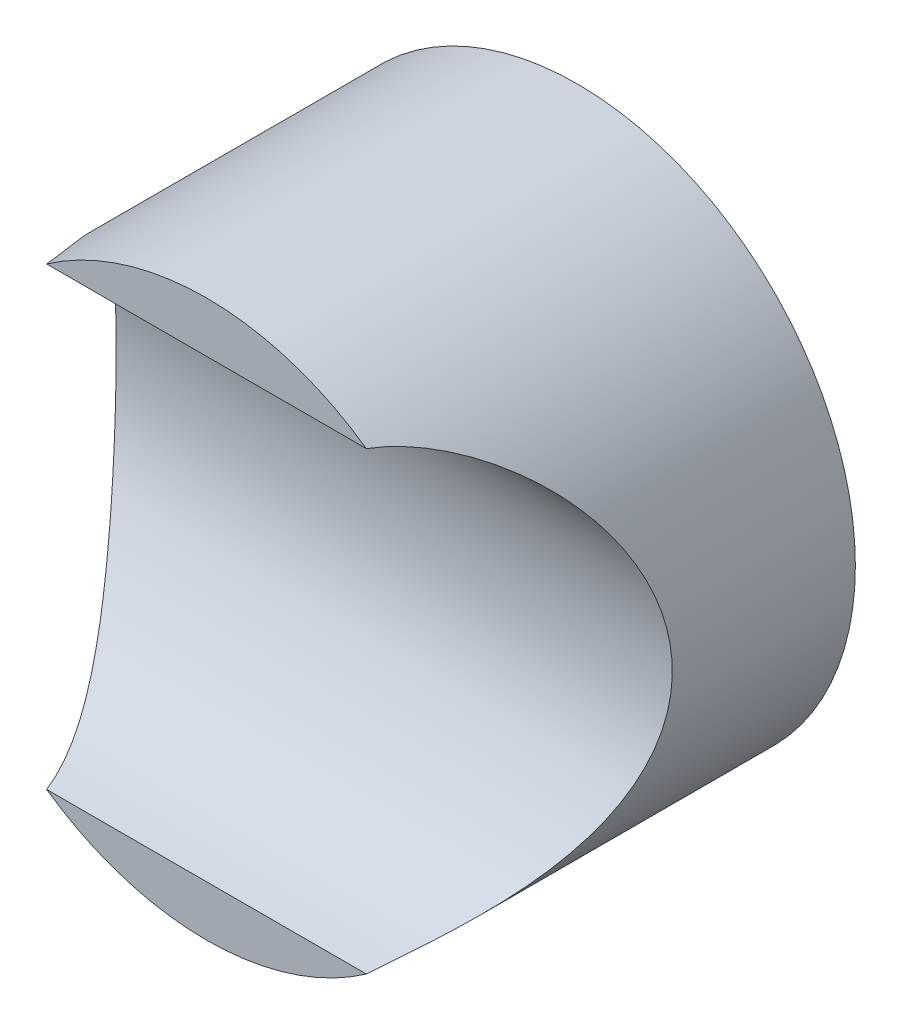
ISO-10303-21;
HEADER;
FILE_DESCRIPTION(('STEP AP214'),'2;1');
FILE_NAME('part.step','',(''),(''),'','','');
FILE_SCHEMA(('AUTOMOTIVE_DESIGN { 1 0 10303 214 1 1 1 1 }'));
ENDSEC;
DATA;
#1=APPLICATION_CONTEXT('core data for automotive mechanical design processes');
#2=APPLICATION_PROTOCOL_DEFINITION('international standard','automotive_design',2000,#1);
#3=PRODUCT_CONTEXT('',#1,'mechanical');
#4=PRODUCT('Part','Part','',(#3));
#5=PRODUCT_RELATED_PRODUCT_CATEGORY('part','',(#4));
#6=PRODUCT_DEFINITION_FORMATION('','',#4);
#7=PRODUCT_DEFINITION_CONTEXT('part definition',#1,'design');
#8=PRODUCT_DEFINITION('design','',#6,#7);
#9=PRODUCT_DEFINITION_SHAPE('','',#8);
#10=(LENGTH_UNIT() NAMED_UNIT(*) SI_UNIT(.MILLI.,.METRE.));
#11=(NAMED_UNIT(*) PLANE_ANGLE_UNIT() SI_UNIT($,.RADIAN.));
#12=(NAMED_UNIT(*) SI_UNIT($,.STERADIAN.) SOLID_ANGLE_UNIT());
#13=UNCERTAINTY_MEASURE_WITH_UNIT(LENGTH_MEASURE(1.E-05),#10,'distance_accuracy_value','');
#14=(GEOMETRIC_REPRESENTATION_CONTEXT(3) GLOBAL_UNCERTAINTY_ASSIGNED_CONTEXT((#13)) GLOBAL_UNIT_ASSIGNED_CONTEXT((#10,
#11,#12)) REPRESENTATION_CONTEXT('',''));
#15=CARTESIAN_POINT('',(0.,0.,0.));
#16=DIRECTION('',(0.,0.,1.));
#17=DIRECTION('',(1.,0.,0.));
#18=AXIS2_PLACEMENT_3D('',#15,#16,#17);
#19=CARTESIAN_POINT('',(0.,0.,40.));
#20=DIRECTION('',(0.,0.,1.));
#21=DIRECTION('',(1.,0.,0.));
#22=AXIS2_PLACEMENT_3D('',#19,#20,#21);
#23=PLANE('',#22);
#24=DIRECTION('',(1.,0.,0.));
#25=VECTOR('',#24,1.);
#26=CARTESIAN_POINT('',(-30.,-24.5452103521427,40.));
#27=LINE('',#26,#25);
#28=CARTESIAN_POINT('',(-17.249134725228,-24.5452103521427,40.));
#29=VERTEX_POINT('',#28);
#30=CARTESIAN_POINT('',(17.249134725228,-24.5452103521427,40.));
#31=VERTEX_POINT('',#30);
#32=EDGE_CURVE('E11',#29,#31,#27,.T.);
#33=ORIENTED_EDGE('',*,*,#32,.F.);
#34=CARTESIAN_POINT('',(0.,0.,40.));
#35=DIRECTION('',(0.,0.,1.));
#36=DIRECTION('',(1.,0.,0.));
#37=AXIS2_PLACEMENT_3D('',#34,#35,#36);
#38=CIRCLE('',#37,30.);
#39=EDGE_CURVE('E71',#29,#31,#38,.T.);
#40=ORIENTED_EDGE('',*,*,#39,.T.);
#41=EDGE_LOOP('',(#33,#40));
#42=FACE_BOUND('',#41,.T.);
#43=ADVANCED_FACE('F39',(#42),#23,.T.);
#44=CARTESIAN_POINT('',(0.,0.,40.));
#45=DIRECTION('',(0.,0.,-1.));
#46=DIRECTION('',(-1.,0.,0.));
#47=AXIS2_PLACEMENT_3D('',#44,#45,#46);
#48=CYLINDRICAL_SURFACE('',#47,30.);
#49=CARTESIAN_POINT('',(17.249134725228,24.5452103521427,40.));
#50=VERTEX_POINT('',#49);
#51=CARTESIAN_POINT('',(-17.249134725228,24.5452103521427,40.));
#52=VERTEX_POINT('',#51);
#53=EDGE_CURVE('E69',#50,#52,#38,.T.);
#54=ORIENTED_EDGE('',*,*,#53,.F.);
#55=CARTESIAN_POINT('',(17.249134725228,24.5452103521427,40.));
#56=CARTESIAN_POINT('',(17.3456637872006,24.4773760764151,39.6492450799394));
#57=CARTESIAN_POINT('',(17.4509957520615,24.4025037661638,39.3024160576223));
#58=CARTESIAN_POINT('',(17.6767778042311,24.2394485499741,38.6171678382151));
#59=CARTESIAN_POINT('',(17.7972171494787,24.1512750928412,38.2787428682746));
#60=CARTESIAN_POINT('',(18.0504615603682,23.962589140414,37.6114390691279));
#61=CARTESIAN_POINT('',(18.1832255953066,23.8621172559971,37.282533030278));
#62=CARTESIAN_POINT('',(18.4593215668455,23.6491838996391,36.6331104979196));
#63=CARTESIAN_POINT('',(18.602655568781,23.5367200825911,36.3125956606898));
#64=CARTESIAN_POINT('',(19.0446726055925,23.1828003707353,35.3654137513566));
#65=CARTESIAN_POINT('',(19.3561834534077,22.924222735384,34.751034852978));
#66=CARTESIAN_POINT('',(20.0008816953985,22.36398128985,33.5535640156192));
#67=CARTESIAN_POINT('',(20.3340915986709,22.0622723377455,32.9705057481412));
#68=CARTESIAN_POINT('',(21.0832241496513,21.3498857180443,31.715884553071));
#69=CARTESIAN_POINT('',(21.5018525820912,20.9296205328434,31.0513646379643));
#70=CARTESIAN_POINT('',(22.3424306255643,20.0298573695418,29.7662059405244));
#71=CARTESIAN_POINT('',(22.764379926997,19.550364853293,29.1455631202015));
#72=CARTESIAN_POINT('',(23.6011025761193,18.5316785969205,27.9481816956885));
#73=CARTESIAN_POINT('',(24.0158654897443,17.9924052919151,27.3715033700989));
#74=CARTESIAN_POINT('',(24.8275090486665,16.8547576314341,26.2658963211141));
#75=CARTESIAN_POINT('',(25.2243945193162,16.2563993646376,25.7369546738198));
#76=CARTESIAN_POINT('',(25.901410060431,15.1471248279558,24.8484848723616));
#77=CARTESIAN_POINT('',(26.1872136846149,14.6482737394089,24.4781809396392));
#78=CARTESIAN_POINT('',(26.7382158208434,13.6165261302304,23.7711257585506));
#79=CARTESIAN_POINT('',(27.0034159549897,13.0836322957975,23.4343718682171));
#80=CARTESIAN_POINT('',(27.5083702374627,11.985575259723,22.7981021867074));
#81=CARTESIAN_POINT('',(27.7481609719762,11.4204603077512,22.4985327452194));
#82=CARTESIAN_POINT('',(28.0855629873626,10.5497919734755,22.0795748215035));
#83=CARTESIAN_POINT('',(28.1943128454604,10.2557473936417,21.9449924592543));
#84=CARTESIAN_POINT('',(28.4038830515337,9.66018143760121,21.6863641087691));
#85=CARTESIAN_POINT('',(28.5047012981422,9.3586581076501,21.5623209120428));
#86=CARTESIAN_POINT('',(28.7636076127421,8.54073238163488,21.2445483477689));
#87=CARTESIAN_POINT('',(28.913925924475,8.01786863366453,21.0609076136637));
#88=CARTESIAN_POINT('',(29.1878721587688,6.95480846512938,20.7272617090758));
#89=CARTESIAN_POINT('',(29.3115049853904,6.41461525024023,20.5772503582385));
#90=CARTESIAN_POINT('',(29.5296345729785,5.32081387249773,20.3131740619917));
#91=CARTESIAN_POINT('',(29.6241854363776,4.76723271168898,20.1990423592787));
#92=CARTESIAN_POINT('',(29.7825321701044,3.64953052783866,20.0081810885403));
#93=CARTESIAN_POINT('',(29.8463429484611,3.0854147519393,19.9314333901809));
#94=CARTESIAN_POINT('',(29.9292863586105,2.10078985691042,19.8317467092083));
#95=CARTESIAN_POINT('',(29.9557723903584,1.6817659764275,19.7999443092807));
#96=CARTESIAN_POINT('',(29.9911323426357,0.841845115930386,19.7574958813311));
#97=CARTESIAN_POINT('',(30.0000036042539,0.420947862743485,19.7468530472993));
#98=CARTESIAN_POINT('',(29.9999949207133,-0.593219832914178,19.7468619081437));
#99=CARTESIAN_POINT('',(29.9823645419507,-1.18654017535763,19.7680108428263));
#100=CARTESIAN_POINT('',(29.912231115269,-2.36837351381449,19.8522368272949));
#101=CARTESIAN_POINT('',(29.8597090696207,-2.95688371400605,19.9153367184493));
#102=CARTESIAN_POINT('',(29.7208566059373,-4.12522014991265,20.0824798693034));
#103=CARTESIAN_POINT('',(29.634458301101,-4.70502650579282,20.1866053448452));
#104=CARTESIAN_POINT('',(29.4297755848008,-5.85036431882013,20.43396901525));
#105=CARTESIAN_POINT('',(29.3114948331949,-6.41589740628394,20.5772027208156));
#106=CARTESIAN_POINT('',(29.0463436120151,-7.5255051527662,20.8994584624447));
#107=CARTESIAN_POINT('',(28.8996656036885,-8.06969615952752,21.0782397848295));
#108=CARTESIAN_POINT('',(28.5799442230966,-9.13769917393854,21.4697012696507));
#109=CARTESIAN_POINT('',(28.4069006648122,-9.66151103777272,21.6823816712588));
#110=CARTESIAN_POINT('',(28.0374278619561,-10.6864072170946,22.1389963591995));
#111=CARTESIAN_POINT('',(27.8410087309075,-11.1875012328846,22.3829171327315));
#112=CARTESIAN_POINT('',(27.4276215747644,-12.165839088112,22.8996948172501));
#113=CARTESIAN_POINT('',(27.2106491924945,-12.6430778374593,23.1725578653132));
#114=CARTESIAN_POINT('',(26.8305707430692,-13.4255469457609,23.6543469640817));
#115=CARTESIAN_POINT('',(26.6721281033317,-13.7374469260185,23.8562050853413));
#116=CARTESIAN_POINT('',(26.3480007929741,-14.3493103061191,24.2716520557926));
#117=CARTESIAN_POINT('',(26.1823176575329,-14.6492762107852,24.485238420723));
#118=CARTESIAN_POINT('',(25.6755915483709,-15.5313816739917,25.1429197015013));
#119=CARTESIAN_POINT('',(25.3249326340286,-16.0956052252847,25.6038602048081));
#120=CARTESIAN_POINT('',(24.6041933135222,-17.17724238879,26.5680416640283));
#121=CARTESIAN_POINT('',(24.2340499096166,-17.6944872919278,27.0714234551633));
#122=CARTESIAN_POINT('',(23.4828202474875,-18.6799584423827,28.1163182476561));
#123=CARTESIAN_POINT('',(23.101735503847,-19.1481914330072,28.6578259862597));
#124=CARTESIAN_POINT('',(22.3288783149011,-20.0444029921208,29.7884923031105));
#125=CARTESIAN_POINT('',(21.9370431140201,-20.4714082323988,30.3783788209371));
#126=CARTESIAN_POINT('',(21.1593655047435,-21.274245003028,31.5962424197635));
#127=CARTESIAN_POINT('',(20.7735254872196,-21.6500565590613,32.2242342310169));
#128=CARTESIAN_POINT('',(20.0218074346577,-22.3469981330934,33.5153386672197));
#129=CARTESIAN_POINT('',(19.6558267766784,-22.6684320869978,34.178226949983));
#130=CARTESIAN_POINT('',(18.9564800376353,-23.2563952248731,35.5440364316996));
#131=CARTESIAN_POINT('',(18.6230790572445,-23.5229835056194,36.2469134883948));
#132=CARTESIAN_POINT('',(18.2128279870635,-23.8392541780106,37.2132546733433));
#133=CARTESIAN_POINT('',(18.112686465334,-23.9153778293991,37.4584256510882));
#134=CARTESIAN_POINT('',(17.9192256746238,-24.0606714825537,37.9534309468576));
#135=CARTESIAN_POINT('',(17.8259047993798,-24.129843122968,38.2032641494166));
#136=CARTESIAN_POINT('',(17.5571161981603,-24.3268842561337,38.9610510220702));
#137=CARTESIAN_POINT('',(17.3933739993382,-24.4438596625826,39.4760161857731));
#138=CARTESIAN_POINT('',(17.249134725228,-24.5452103521427,40.));
#139=B_SPLINE_CURVE_WITH_KNOTS('',3,(#55,#56,#57,#58,#59,#60,#61,#62,#63,#64,#65,#66,#67,#68,
#69,#70,#71,#72,#73,#74,#75,#76,#77,#78,#79,#80,#81,#82,#83,#84,#85,#86,#87,#88,#89,#90,#91,#92,
#93,#94,#95,#96,#97,#98,#99,#100,#101,#102,#103,#104,#105,#106,#107,#108,#109,#110,#111,#112,
#113,#114,#115,#116,#117,#118,#119,#120,#121,#122,#123,#124,#125,#126,#127,#128,#129,#130,#131,
#132,#133,#134,#135,#136,#137,#138),.UNSPECIFIED.,.F.,.F.,(4,2,2,2,2,2,2,2,2,2,2,2,2,2,2,2,2,2,
2,2,2,2,2,2,2,2,2,2,2,2,2,2,2,2,2,2,2,2,2,2,2,4),(0.,1.10980754438397,2.21883038951801,
3.32428519222282,4.42995657225575,6.63440905384714,8.84118587567714,11.510199789753,
14.1789677550396,16.8513313425389,19.5229692486675,21.5727456086561,23.6223604269728,
25.6689827787284,26.6922212897759,27.7157299866405,29.4364390150376,31.1568315545449,
32.8740039407493,34.5903427088431,35.8526708657696,37.1151895539046,38.8943911879151,
40.674562352114,42.458319299194,44.2418715719338,46.0137342362044,47.7856094022339,
49.556720728381,51.3282083641878,52.5394978813873,53.7505318071829,56.1730711437745,
58.6039920855952,61.0345781281581,63.5129887193242,65.9923635628149,68.4573863460181,
70.9197389676975,71.7462541992134,72.5725741548752,74.2295548489852),.UNSPECIFIED.);
#140=EDGE_CURVE('E55',#50,#31,#139,.T.);
#141=ORIENTED_EDGE('',*,*,#140,.T.);
#142=ORIENTED_EDGE('',*,*,#39,.F.);
#143=CARTESIAN_POINT('',(-17.249134725228,-24.5452103521427,40.));
#144=CARTESIAN_POINT('',(-17.3456637872006,-24.4773760764151,39.6492450799394));
#145=CARTESIAN_POINT('',(-17.4509957520615,-24.4025037661638,39.3024160576223));
#146=CARTESIAN_POINT('',(-17.6767778042311,-24.2394485499741,38.6171678382151));
#147=CARTESIAN_POINT('',(-17.7972171494787,-24.1512750928412,38.2787428682746));
#148=CARTESIAN_POINT('',(-18.0504615603682,-23.962589140414,37.6114390691279));
#149=CARTESIAN_POINT('',(-18.1832255953066,-23.8621172559971,37.282533030278));
#150=CARTESIAN_POINT('',(-18.4593215668455,-23.6491838996391,36.6331104979196));
#151=CARTESIAN_POINT('',(-18.602655568781,-23.5367200825911,36.3125956606898));
#152=CARTESIAN_POINT('',(-19.0446726055925,-23.1828003707353,35.3654137513566));
#153=CARTESIAN_POINT('',(-19.3561834534077,-22.924222735384,34.751034852978));
#154=CARTESIAN_POINT('',(-20.0008816953985,-22.36398128985,33.5535640156192));
#155=CARTESIAN_POINT('',(-20.3340915986709,-22.0622723377455,32.9705057481412));
#156=CARTESIAN_POINT('',(-21.0832241496513,-21.3498857180443,31.715884553071));
#157=CARTESIAN_POINT('',(-21.5018525820912,-20.9296205328434,31.0513646379643));
#158=CARTESIAN_POINT('',(-22.3424306255643,-20.0298573695418,29.7662059405244));
#159=CARTESIAN_POINT('',(-22.764379926997,-19.550364853293,29.1455631202015));
#160=CARTESIAN_POINT('',(-23.6011025761193,-18.5316785969205,27.9481816956885));
#161=CARTESIAN_POINT('',(-24.0158654897443,-17.9924052919151,27.3715033700989));
#162=CARTESIAN_POINT('',(-24.8275090486665,-16.8547576314341,26.2658963211141));
#163=CARTESIAN_POINT('',(-25.2243945193162,-16.2563993646376,25.7369546738198));
#164=CARTESIAN_POINT('',(-25.901410060431,-15.1471248279558,24.8484848723616));
#165=CARTESIAN_POINT('',(-26.1872136846149,-14.6482737394089,24.4781809396392));
#166=CARTESIAN_POINT('',(-26.7382158208434,-13.6165261302304,23.7711257585506));
#167=CARTESIAN_POINT('',(-27.0034159549897,-13.0836322957975,23.4343718682171));
#168=CARTESIAN_POINT('',(-27.5083702374627,-11.985575259723,22.7981021867074));
#169=CARTESIAN_POINT('',(-27.7481609719762,-11.4204603077512,22.4985327452194));
#170=CARTESIAN_POINT('',(-28.0855629873626,-10.5497919734755,22.0795748215035));
#171=CARTESIAN_POINT('',(-28.1943128454604,-10.2557473936417,21.9449924592543));
#172=CARTESIAN_POINT('',(-28.4038830515337,-9.66018143760121,21.6863641087691));
#173=CARTESIAN_POINT('',(-28.5047012981422,-9.3586581076501,21.5623209120428));
#174=CARTESIAN_POINT('',(-28.7636076127421,-8.54073238163488,21.2445483477689));
#175=CARTESIAN_POINT('',(-28.913925924475,-8.01786863366453,21.0609076136637));
#176=CARTESIAN_POINT('',(-29.1878721587688,-6.95480846512938,20.7272617090758));
#177=CARTESIAN_POINT('',(-29.3115049853904,-6.41461525024023,20.5772503582385));
#178=CARTESIAN_POINT('',(-29.5296345729785,-5.32081387249773,20.3131740619917));
#179=CARTESIAN_POINT('',(-29.6241854363776,-4.76723271168898,20.1990423592787));
#180=CARTESIAN_POINT('',(-29.7825321701044,-3.64953052783866,20.0081810885403));
#181=CARTESIAN_POINT('',(-29.8463429484611,-3.0854147519393,19.9314333901809));
#182=CARTESIAN_POINT('',(-29.9292863586105,-2.10078985691042,19.8317467092083));
#183=CARTESIAN_POINT('',(-29.9557723903584,-1.6817659764275,19.7999443092807));
#184=CARTESIAN_POINT('',(-29.9911323426357,-0.841845115930386,19.7574958813311));
#185=CARTESIAN_POINT('',(-30.0000036042539,-0.420947862743485,19.7468530472993));
#186=CARTESIAN_POINT('',(-29.9999949207133,0.593219832914178,19.7468619081437));
#187=CARTESIAN_POINT('',(-29.9823645419507,1.18654017535763,19.7680108428263));
#188=CARTESIAN_POINT('',(-29.912231115269,2.36837351381449,19.8522368272949));
#189=CARTESIAN_POINT('',(-29.8597090696207,2.95688371400605,19.9153367184493));
#190=CARTESIAN_POINT('',(-29.7208566059373,4.12522014991265,20.0824798693034));
#191=CARTESIAN_POINT('',(-29.634458301101,4.70502650579282,20.1866053448452));
#192=CARTESIAN_POINT('',(-29.4297755848008,5.85036431882013,20.43396901525));
#193=CARTESIAN_POINT('',(-29.3114948331949,6.41589740628394,20.5772027208156));
#194=CARTESIAN_POINT('',(-29.0463436120151,7.5255051527662,20.8994584624447));
#195=CARTESIAN_POINT('',(-28.8996656036885,8.06969615952752,21.0782397848295));
#196=CARTESIAN_POINT('',(-28.5799442230966,9.13769917393854,21.4697012696507));
#197=CARTESIAN_POINT('',(-28.4069006648122,9.66151103777272,21.6823816712588));
#198=CARTESIAN_POINT('',(-28.0374278619561,10.6864072170946,22.1389963591995));
#199=CARTESIAN_POINT('',(-27.8410087309075,11.1875012328846,22.3829171327315));
#200=CARTESIAN_POINT('',(-27.4276215747644,12.165839088112,22.8996948172501));
#201=CARTESIAN_POINT('',(-27.2106491924945,12.6430778374593,23.1725578653132));
#202=CARTESIAN_POINT('',(-26.8305707430692,13.4255469457609,23.6543469640817));
#203=CARTESIAN_POINT('',(-26.6721281033317,13.7374469260185,23.8562050853413));
#204=CARTESIAN_POINT('',(-26.3480007929741,14.3493103061191,24.2716520557926));
#205=CARTESIAN_POINT('',(-26.1823176575329,14.6492762107852,24.485238420723));
#206=CARTESIAN_POINT('',(-25.6755915483709,15.5313816739917,25.1429197015013));
#207=CARTESIAN_POINT('',(-25.3249326340286,16.0956052252847,25.6038602048081));
#208=CARTESIAN_POINT('',(-24.6041933135222,17.17724238879,26.5680416640283));
#209=CARTESIAN_POINT('',(-24.2340499096166,17.6944872919278,27.0714234551633));
#210=CARTESIAN_POINT('',(-23.4828202474875,18.6799584423827,28.1163182476561));
#211=CARTESIAN_POINT('',(-23.101735503847,19.1481914330072,28.6578259862597));
#212=CARTESIAN_POINT('',(-22.3288783149011,20.0444029921208,29.7884923031105));
#213=CARTESIAN_POINT('',(-21.9370431140201,20.4714082323988,30.3783788209371));
#214=CARTESIAN_POINT('',(-21.1593655047435,21.274245003028,31.5962424197635));
#215=CARTESIAN_POINT('',(-20.7735254872196,21.6500565590613,32.2242342310169));
#216=CARTESIAN_POINT('',(-20.0218074346577,22.3469981330934,33.5153386672197));
#217=CARTESIAN_POINT('',(-19.6558267766784,22.6684320869978,34.178226949983));
#218=CARTESIAN_POINT('',(-18.9564800376353,23.2563952248731,35.5440364316996));
#219=CARTESIAN_POINT('',(-18.6230790572445,23.5229835056194,36.2469134883948));
#220=CARTESIAN_POINT('',(-18.2128279870635,23.8392541780106,37.2132546733433));
#221=CARTESIAN_POINT('',(-18.112686465334,23.9153778293991,37.4584256510882));
#222=CARTESIAN_POINT('',(-17.9192256746238,24.0606714825537,37.9534309468576));
#223=CARTESIAN_POINT('',(-17.8259047993798,24.129843122968,38.2032641494166));
#224=CARTESIAN_POINT('',(-17.5571161981603,24.3268842561337,38.9610510220702));
#225=CARTESIAN_POINT('',(-17.3933739993382,24.4438596625826,39.4760161857731));
#226=CARTESIAN_POINT('',(-17.249134725228,24.5452103521427,40.));
#227=B_SPLINE_CURVE_WITH_KNOTS('',3,(#143,#144,#145,#146,#147,#148,#149,#150,#151,#152,#153,
#154,#155,#156,#157,#158,#159,#160,#161,#162,#163,#164,#165,#166,#167,#168,#169,#170,#171,#172,
#173,#174,#175,#176,#177,#178,#179,#180,#181,#182,#183,#184,#185,#186,#187,#188,#189,#190,#191,
#192,#193,#194,#195,#196,#197,#198,#199,#200,#201,#202,#203,#204,#205,#206,#207,#208,#209,#210,
#211,#212,#213,#214,#215,#216,#217,#218,#219,#220,#221,#222,#223,#224,#225,#226),.UNSPECIFIED.,
.F.,.F.,(4,2,2,2,2,2,2,2,2,2,2,2,2,2,2,2,2,2,2,2,2,2,2,2,2,2,2,2,2,2,2,2,2,2,2,2,2,2,2,2,2,4),
(0.,1.10980754438397,2.21883038951801,3.32428519222282,4.42995657225575,6.63440905384714,
8.84118587567714,11.510199789753,14.1789677550396,16.8513313425389,19.5229692486675,
21.5727456086561,23.6223604269728,25.6689827787284,26.6922212897759,27.7157299866405,
29.4364390150376,31.1568315545449,32.8740039407493,34.5903427088431,35.8526708657696,
37.1151895539046,38.8943911879151,40.674562352114,42.458319299194,44.2418715719338,
46.0137342362044,47.7856094022339,49.556720728381,51.3282083641878,52.5394978813873,
53.7505318071829,56.1730711437745,58.6039920855952,61.0345781281581,63.5129887193242,
65.9923635628149,68.4573863460181,70.9197389676975,71.7462541992134,72.5725741548752,
74.2295548489852),.UNSPECIFIED.);
#228=EDGE_CURVE('E66',#29,#52,#227,.T.);
#229=ORIENTED_EDGE('',*,*,#228,.T.);
#230=EDGE_LOOP('',(#54,#141,#142,#229));
#231=FACE_BOUND('',#230,.T.);
#232=CARTESIAN_POINT('',(0.,0.,0.));
#233=DIRECTION('',(0.,0.,1.));
#234=DIRECTION('',(1.,0.,0.));
#235=AXIS2_PLACEMENT_3D('',#232,#233,#234);
#236=CIRCLE('',#235,30.);
#237=CARTESIAN_POINT('',(30.,0.,0.));
#238=VERTEX_POINT('',#237);
#239=EDGE_CURVE('E83',#238,#238,#236,.T.);
#240=ORIENTED_EDGE('',*,*,#239,.T.);
#241=EDGE_LOOP('',(#240));
#242=FACE_BOUND('',#241,.T.);
#243=ADVANCED_FACE('F41',(#231,#242),#48,.T.);
#244=DIRECTION('',(1.,0.,0.));
#245=VECTOR('',#244,1.);
#246=CARTESIAN_POINT('',(-30.,24.5452103521427,40.));
#247=LINE('',#246,#245);
#248=EDGE_CURVE('E49',#50,#52,#247,.F.);
#249=ORIENTED_EDGE('',*,*,#248,.F.);
#250=ORIENTED_EDGE('',*,*,#53,.T.);
#251=EDGE_LOOP('',(#249,#250));
#252=FACE_BOUND('',#251,.T.);
#253=ADVANCED_FACE('F79',(#252),#23,.T.);
#254=CARTESIAN_POINT('',(0.,0.,0.));
#255=DIRECTION('',(0.,0.,1.));
#256=DIRECTION('',(1.,0.,0.));
#257=AXIS2_PLACEMENT_3D('',#254,#255,#256);
#258=PLANE('',#257);
#259=CARTESIAN_POINT('',(0.,0.,0.));
#260=DIRECTION('',(0.,0.,-1.));
#261=DIRECTION('',(-1.,0.,0.));
#262=AXIS2_PLACEMENT_3D('',#259,#260,#261);
#263=CIRCLE('',#262,10.);
#264=CARTESIAN_POINT('',(-10.,0.,0.));
#265=VERTEX_POINT('',#264);
#266=EDGE_CURVE('E98',#265,#265,#263,.T.);
#267=ORIENTED_EDGE('',*,*,#266,.F.);
#268=EDGE_LOOP('',(#267));
#269=FACE_BOUND('',#268,.T.);
#270=ORIENTED_EDGE('',*,*,#239,.F.);
#271=EDGE_LOOP('',(#270));
#272=FACE_BOUND('',#271,.T.);
#273=ADVANCED_FACE('F113',(#269,#272),#258,.F.);
#274=CARTESIAN_POINT('',(-30.,0.,44.7468567251462));
#275=DIRECTION('',(1.,0.,0.));
#276=DIRECTION('',(0.,0.,-1.));
#277=AXIS2_PLACEMENT_3D('',#274,#275,#276);
#278=CYLINDRICAL_SURFACE('',#277,25.);
#279=ORIENTED_EDGE('',*,*,#140,.F.);
#280=ORIENTED_EDGE('',*,*,#248,.T.);
#281=ORIENTED_EDGE('',*,*,#228,.F.);
#282=ORIENTED_EDGE('',*,*,#32,.T.);
#283=EDGE_LOOP('',(#279,#280,#281,#282));
#284=FACE_BOUND('',#283,.T.);
#285=ADVANCED_FACE('F76',(#284),#278,.F.);
#286=CARTESIAN_POINT('',(0.,0.,2.));
#287=DIRECTION('',(0.,0.,-1.));
#288=DIRECTION('',(-1.,0.,0.));
#289=AXIS2_PLACEMENT_3D('',#286,#287,#288);
#290=CYLINDRICAL_SURFACE('',#289,10.);
#291=CARTESIAN_POINT('',(0.,0.,2.));
#292=DIRECTION('',(0.,0.,-1.));
#293=DIRECTION('',(-1.,0.,0.));
#294=AXIS2_PLACEMENT_3D('',#291,#292,#293);
#295=CIRCLE('',#294,10.);
#296=CARTESIAN_POINT('',(-10.,0.,2.));
#297=VERTEX_POINT('',#296);
#298=EDGE_CURVE('E74',#297,#297,#295,.T.);
#299=ORIENTED_EDGE('',*,*,#298,.F.);
#300=EDGE_LOOP('',(#299));
#301=FACE_BOUND('',#300,.T.);
#302=ORIENTED_EDGE('',*,*,#266,.T.);
#303=EDGE_LOOP('',(#302));
#304=FACE_BOUND('',#303,.T.);
#305=ADVANCED_FACE('F112',(#301,#304),#290,.F.);
#306=CARTESIAN_POINT('',(0.,0.,2.));
#307=DIRECTION('',(0.,0.,-1.));
#308=DIRECTION('',(-1.,0.,0.));
#309=AXIS2_PLACEMENT_3D('',#306,#307,#308);
#310=PLANE('',#309);
#311=ORIENTED_EDGE('',*,*,#298,.T.);
#312=EDGE_LOOP('',(#311));
#313=FACE_BOUND('',#312,.T.);
#314=ADVANCED_FACE('F153',(#313),#310,.T.);
#315=CLOSED_SHELL('',(#43,#243,#253,#273,#285,#305,#314));
#316=MANIFOLD_SOLID_BREP('B2',#315);
#317=ADVANCED_BREP_SHAPE_REPRESENTATION('',(#18,#316),#14);
#318=SHAPE_DEFINITION_REPRESENTATION(#9,#317);
ENDSEC;
END-ISO-10303-21;
